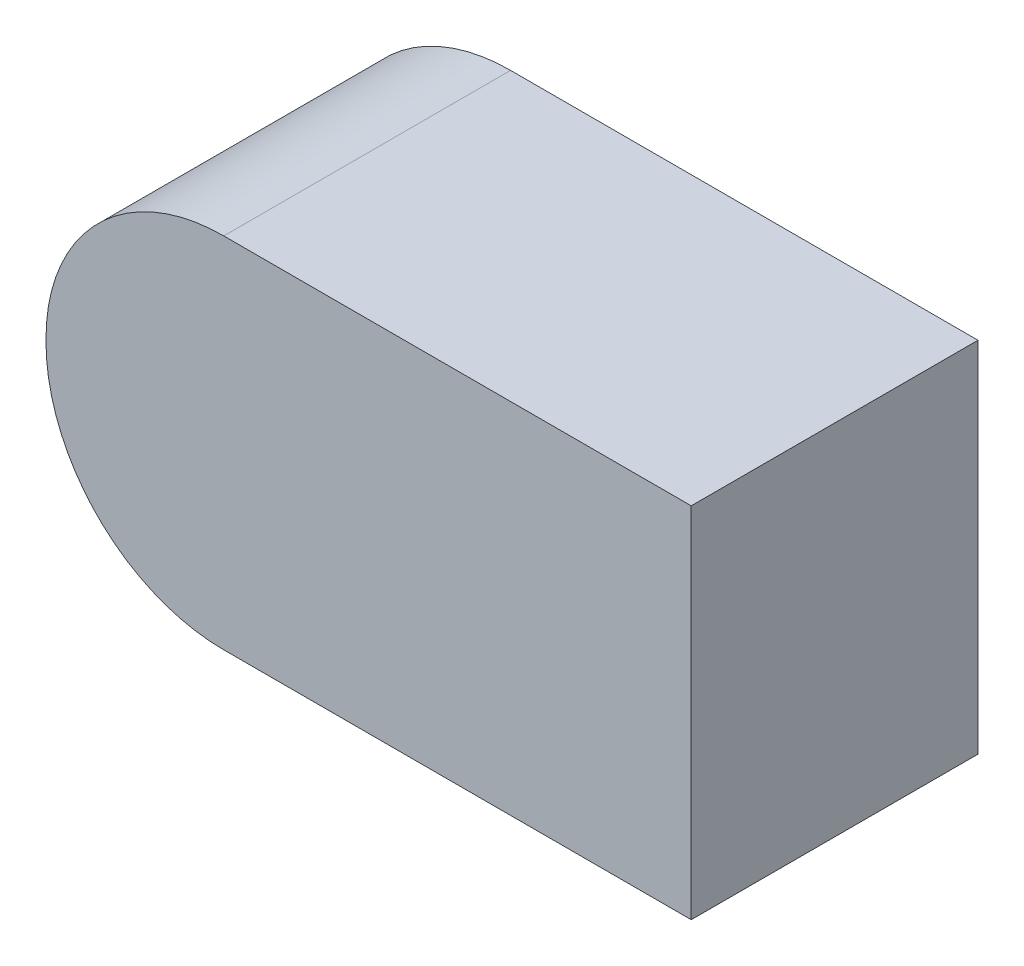
ISO-10303-21;
HEADER;
FILE_DESCRIPTION(('STEP AP214'),'2;1');
FILE_NAME('part.step','',(''),(''),'','','');
FILE_SCHEMA(('AUTOMOTIVE_DESIGN { 1 0 10303 214 1 1 1 1 }'));
ENDSEC;
DATA;
#1=APPLICATION_CONTEXT('core data for automotive mechanical design processes');
#2=APPLICATION_PROTOCOL_DEFINITION('international standard','automotive_design',2000,#1);
#3=PRODUCT_CONTEXT('',#1,'mechanical');
#4=PRODUCT('Part','Part','',(#3));
#5=PRODUCT_RELATED_PRODUCT_CATEGORY('part','',(#4));
#6=PRODUCT_DEFINITION_FORMATION('','',#4);
#7=PRODUCT_DEFINITION_CONTEXT('part definition',#1,'design');
#8=PRODUCT_DEFINITION('design','',#6,#7);
#9=PRODUCT_DEFINITION_SHAPE('','',#8);
#10=(LENGTH_UNIT() NAMED_UNIT(*) SI_UNIT(.MILLI.,.METRE.));
#11=(NAMED_UNIT(*) PLANE_ANGLE_UNIT() SI_UNIT($,.RADIAN.));
#12=(NAMED_UNIT(*) SI_UNIT($,.STERADIAN.) SOLID_ANGLE_UNIT());
#13=UNCERTAINTY_MEASURE_WITH_UNIT(LENGTH_MEASURE(1.E-05),#10,'distance_accuracy_value','');
#14=(GEOMETRIC_REPRESENTATION_CONTEXT(3) GLOBAL_UNCERTAINTY_ASSIGNED_CONTEXT((#13)) GLOBAL_UNIT_ASSIGNED_CONTEXT((#10,
#11,#12)) REPRESENTATION_CONTEXT('',''));
#15=CARTESIAN_POINT('',(0.,0.,0.));
#16=DIRECTION('',(0.,0.,1.));
#17=DIRECTION('',(1.,0.,0.));
#18=AXIS2_PLACEMENT_3D('',#15,#16,#17);
#19=CARTESIAN_POINT('',(-0.101,0.0009999999999999,0.2));
#20=DIRECTION('',(0.,0.,-1.));
#21=DIRECTION('',(-1.,0.,0.));
#22=AXIS2_PLACEMENT_3D('',#19,#20,#21);
#23=CYLINDRICAL_SURFACE('',#22,0.124);
#24=DIRECTION('',(0.,0.,-1.));
#25=VECTOR('',#24,1.);
#26=CARTESIAN_POINT('',(-0.225,0.0009999999999996,0.2));
#27=LINE('',#26,#25);
#28=CARTESIAN_POINT('',(-0.225,0.0009999999999996,0.2));
#29=VERTEX_POINT('',#28);
#30=CARTESIAN_POINT('',(-0.225,0.0009999999999991,0.));
#31=VERTEX_POINT('',#30);
#32=EDGE_CURVE('E11',#29,#31,#27,.T.);
#33=ORIENTED_EDGE('',*,*,#32,.F.);
#34=CARTESIAN_POINT('',(-0.101,0.0009999999999999,0.2));
#35=DIRECTION('',(0.,0.,-1.));
#36=DIRECTION('',(-1.,0.,0.));
#37=AXIS2_PLACEMENT_3D('',#34,#35,#36);
#38=CIRCLE('',#37,0.124);
#39=CARTESIAN_POINT('',(-0.101,0.125,0.2));
#40=VERTEX_POINT('',#39);
#41=EDGE_CURVE('E55',#29,#40,#38,.T.);
#42=ORIENTED_EDGE('',*,*,#41,.T.);
#43=DIRECTION('',(0.,0.,1.));
#44=VECTOR('',#43,1.);
#45=CARTESIAN_POINT('',(-0.101,0.125,0.));
#46=LINE('',#45,#44);
#47=CARTESIAN_POINT('',(-0.101,0.125,0.));
#48=VERTEX_POINT('',#47);
#49=EDGE_CURVE('E62',#48,#40,#46,.T.);
#50=ORIENTED_EDGE('',*,*,#49,.F.);
#51=CARTESIAN_POINT('',(-0.101,0.0009999999999999,0.));
#52=DIRECTION('',(0.,0.,1.));
#53=DIRECTION('',(0.,1.,0.));
#54=AXIS2_PLACEMENT_3D('',#51,#52,#53);
#55=CIRCLE('',#54,0.124);
#56=EDGE_CURVE('E119',#48,#31,#55,.T.);
#57=ORIENTED_EDGE('',*,*,#56,.T.);
#58=EDGE_LOOP('',(#33,#42,#50,#57));
#59=FACE_BOUND('',#58,.T.);
#60=ADVANCED_FACE('F17',(#59),#23,.T.);
#61=CARTESIAN_POINT('',(-0.225,0.0009999999999999,0.2));
#62=DIRECTION('',(1.,0.,0.));
#63=DIRECTION('',(0.,1.,0.));
#64=AXIS2_PLACEMENT_3D('',#61,#62,#63);
#65=PLANE('',#64);
#66=DIRECTION('',(0.,-1.,0.));
#67=VECTOR('',#66,1.);
#68=CARTESIAN_POINT('',(-0.225,0.0009999999999996,0.));
#69=LINE('',#68,#67);
#70=CARTESIAN_POINT('',(-0.225,-0.001,0.));
#71=VERTEX_POINT('',#70);
#72=EDGE_CURVE('E102',#31,#71,#69,.T.);
#73=ORIENTED_EDGE('',*,*,#72,.T.);
#74=DIRECTION('',(0.,0.,1.));
#75=VECTOR('',#74,1.);
#76=CARTESIAN_POINT('',(-0.225,-0.001,0.));
#77=LINE('',#76,#75);
#78=CARTESIAN_POINT('',(-0.225,-0.001,0.2));
#79=VERTEX_POINT('',#78);
#80=EDGE_CURVE('E26',#71,#79,#77,.T.);
#81=ORIENTED_EDGE('',*,*,#80,.T.);
#82=DIRECTION('',(0.,-1.,0.));
#83=VECTOR('',#82,1.);
#84=CARTESIAN_POINT('',(-0.225,0.0009999999999996,0.2));
#85=LINE('',#84,#83);
#86=EDGE_CURVE('E123',#29,#79,#85,.T.);
#87=ORIENTED_EDGE('',*,*,#86,.F.);
#88=ORIENTED_EDGE('',*,*,#32,.T.);
#89=EDGE_LOOP('',(#73,#81,#87,#88));
#90=FACE_BOUND('',#89,.T.);
#91=ADVANCED_FACE('F139',(#90),#65,.F.);
#92=CARTESIAN_POINT('',(-0.101,-0.001,0.2));
#93=DIRECTION('',(0.,0.,-1.));
#94=DIRECTION('',(-1.,0.,0.));
#95=AXIS2_PLACEMENT_3D('',#92,#93,#94);
#96=CYLINDRICAL_SURFACE('',#95,0.124);
#97=DIRECTION('',(0.,0.,-1.));
#98=VECTOR('',#97,1.);
#99=CARTESIAN_POINT('',(-0.101,-0.125,0.2));
#100=LINE('',#99,#98);
#101=CARTESIAN_POINT('',(-0.101,-0.125,0.2));
#102=VERTEX_POINT('',#101);
#103=CARTESIAN_POINT('',(-0.101,-0.125,0.));
#104=VERTEX_POINT('',#103);
#105=EDGE_CURVE('E39',#102,#104,#100,.T.);
#106=ORIENTED_EDGE('',*,*,#105,.F.);
#107=CARTESIAN_POINT('',(-0.101,-0.001,0.2));
#108=DIRECTION('',(0.,0.,-1.));
#109=DIRECTION('',(0.,-1.,0.));
#110=AXIS2_PLACEMENT_3D('',#107,#108,#109);
#111=CIRCLE('',#110,0.124);
#112=EDGE_CURVE('E135',#102,#79,#111,.T.);
#113=ORIENTED_EDGE('',*,*,#112,.T.);
#114=ORIENTED_EDGE('',*,*,#80,.F.);
#115=CARTESIAN_POINT('',(-0.101,-0.001,0.));
#116=DIRECTION('',(0.,0.,1.));
#117=DIRECTION('',(-1.,0.,0.));
#118=AXIS2_PLACEMENT_3D('',#115,#116,#117);
#119=CIRCLE('',#118,0.124);
#120=EDGE_CURVE('E97',#71,#104,#119,.T.);
#121=ORIENTED_EDGE('',*,*,#120,.T.);
#122=EDGE_LOOP('',(#106,#113,#114,#121));
#123=FACE_BOUND('',#122,.T.);
#124=ADVANCED_FACE('F98',(#123),#96,.T.);
#125=CARTESIAN_POINT('',(-0.101,-0.125,0.2));
#126=DIRECTION('',(0.,1.,0.));
#127=DIRECTION('',(1.,0.,0.));
#128=AXIS2_PLACEMENT_3D('',#125,#126,#127);
#129=PLANE('',#128);
#130=DIRECTION('',(1.,0.,0.));
#131=VECTOR('',#130,1.);
#132=CARTESIAN_POINT('',(-0.101,-0.125,0.));
#133=LINE('',#132,#131);
#134=CARTESIAN_POINT('',(0.225,-0.125,0.));
#135=VERTEX_POINT('',#134);
#136=EDGE_CURVE('E90',#104,#135,#133,.T.);
#137=ORIENTED_EDGE('',*,*,#136,.T.);
#138=DIRECTION('',(0.,0.,-1.));
#139=VECTOR('',#138,1.);
#140=CARTESIAN_POINT('',(0.225,-0.125,0.2));
#141=LINE('',#140,#139);
#142=CARTESIAN_POINT('',(0.225,-0.125,0.2));
#143=VERTEX_POINT('',#142);
#144=EDGE_CURVE('E110',#143,#135,#141,.T.);
#145=ORIENTED_EDGE('',*,*,#144,.F.);
#146=DIRECTION('',(1.,0.,0.));
#147=VECTOR('',#146,1.);
#148=CARTESIAN_POINT('',(-0.101,-0.125,0.2));
#149=LINE('',#148,#147);
#150=EDGE_CURVE('E92',#102,#143,#149,.T.);
#151=ORIENTED_EDGE('',*,*,#150,.F.);
#152=ORIENTED_EDGE('',*,*,#105,.T.);
#153=EDGE_LOOP('',(#137,#145,#151,#152));
#154=FACE_BOUND('',#153,.T.);
#155=ADVANCED_FACE('F86',(#154),#129,.F.);
#156=CARTESIAN_POINT('',(-0.101,-0.001,0.2));
#157=DIRECTION('',(0.,0.,1.));
#158=DIRECTION('',(1.,0.,0.));
#159=AXIS2_PLACEMENT_3D('',#156,#157,#158);
#160=PLANE('',#159);
#161=DIRECTION('',(0.,1.,0.));
#162=VECTOR('',#161,1.);
#163=CARTESIAN_POINT('',(0.225,-0.125,0.2));
#164=LINE('',#163,#162);
#165=CARTESIAN_POINT('',(0.225,0.125,0.2));
#166=VERTEX_POINT('',#165);
#167=EDGE_CURVE('E116',#143,#166,#164,.T.);
#168=ORIENTED_EDGE('',*,*,#167,.T.);
#169=DIRECTION('',(-1.,0.,0.));
#170=VECTOR('',#169,1.);
#171=CARTESIAN_POINT('',(0.225,0.125,0.2));
#172=LINE('',#171,#170);
#173=EDGE_CURVE('E124',#166,#40,#172,.T.);
#174=ORIENTED_EDGE('',*,*,#173,.T.);
#175=ORIENTED_EDGE('',*,*,#41,.F.);
#176=ORIENTED_EDGE('',*,*,#86,.T.);
#177=ORIENTED_EDGE('',*,*,#112,.F.);
#178=ORIENTED_EDGE('',*,*,#150,.T.);
#179=EDGE_LOOP('',(#168,#174,#175,#176,#177,#178));
#180=FACE_BOUND('',#179,.T.);
#181=ADVANCED_FACE('F145',(#180),#160,.T.);
#182=CARTESIAN_POINT('',(-0.101,0.125,0.2));
#183=DIRECTION('',(0.,-1.,0.));
#184=DIRECTION('',(0.,0.,-1.));
#185=AXIS2_PLACEMENT_3D('',#182,#183,#184);
#186=PLANE('',#185);
#187=DIRECTION('',(-1.,0.,0.));
#188=VECTOR('',#187,1.);
#189=CARTESIAN_POINT('',(0.225,0.125,0.));
#190=LINE('',#189,#188);
#191=CARTESIAN_POINT('',(0.225,0.125,0.));
#192=VERTEX_POINT('',#191);
#193=EDGE_CURVE('E125',#192,#48,#190,.T.);
#194=ORIENTED_EDGE('',*,*,#193,.T.);
#195=ORIENTED_EDGE('',*,*,#49,.T.);
#196=ORIENTED_EDGE('',*,*,#173,.F.);
#197=DIRECTION('',(0.,0.,-1.));
#198=VECTOR('',#197,1.);
#199=CARTESIAN_POINT('',(0.225,0.125,0.2));
#200=LINE('',#199,#198);
#201=EDGE_CURVE('E153',#166,#192,#200,.T.);
#202=ORIENTED_EDGE('',*,*,#201,.T.);
#203=EDGE_LOOP('',(#194,#195,#196,#202));
#204=FACE_BOUND('',#203,.T.);
#205=ADVANCED_FACE('F167',(#204),#186,.F.);
#206=CARTESIAN_POINT('',(-0.101,-0.001,0.));
#207=DIRECTION('',(0.,0.,1.));
#208=DIRECTION('',(1.,0.,0.));
#209=AXIS2_PLACEMENT_3D('',#206,#207,#208);
#210=PLANE('',#209);
#211=DIRECTION('',(0.,1.,0.));
#212=VECTOR('',#211,1.);
#213=CARTESIAN_POINT('',(0.225,-0.125,0.));
#214=LINE('',#213,#212);
#215=EDGE_CURVE('E108',#135,#192,#214,.T.);
#216=ORIENTED_EDGE('',*,*,#215,.F.);
#217=ORIENTED_EDGE('',*,*,#136,.F.);
#218=ORIENTED_EDGE('',*,*,#120,.F.);
#219=ORIENTED_EDGE('',*,*,#72,.F.);
#220=ORIENTED_EDGE('',*,*,#56,.F.);
#221=ORIENTED_EDGE('',*,*,#193,.F.);
#222=EDGE_LOOP('',(#216,#217,#218,#219,#220,#221));
#223=FACE_BOUND('',#222,.T.);
#224=ADVANCED_FACE('F105',(#223),#210,.F.);
#225=CARTESIAN_POINT('',(0.225,0.125,0.2));
#226=DIRECTION('',(-1.,0.,0.));
#227=DIRECTION('',(0.,0.,1.));
#228=AXIS2_PLACEMENT_3D('',#225,#226,#227);
#229=PLANE('',#228);
#230=ORIENTED_EDGE('',*,*,#215,.T.);
#231=ORIENTED_EDGE('',*,*,#201,.F.);
#232=ORIENTED_EDGE('',*,*,#167,.F.);
#233=ORIENTED_EDGE('',*,*,#144,.T.);
#234=EDGE_LOOP('',(#230,#231,#232,#233));
#235=FACE_BOUND('',#234,.T.);
#236=ADVANCED_FACE('F165',(#235),#229,.F.);
#237=CLOSED_SHELL('',(#60,#91,#124,#155,#181,#205,#224,#236));
#238=MANIFOLD_SOLID_BREP('B1',#237);
#239=ADVANCED_BREP_SHAPE_REPRESENTATION('',(#18,#238),#14);
#240=SHAPE_DEFINITION_REPRESENTATION(#9,#239);
ENDSEC;
END-ISO-10303-21;
